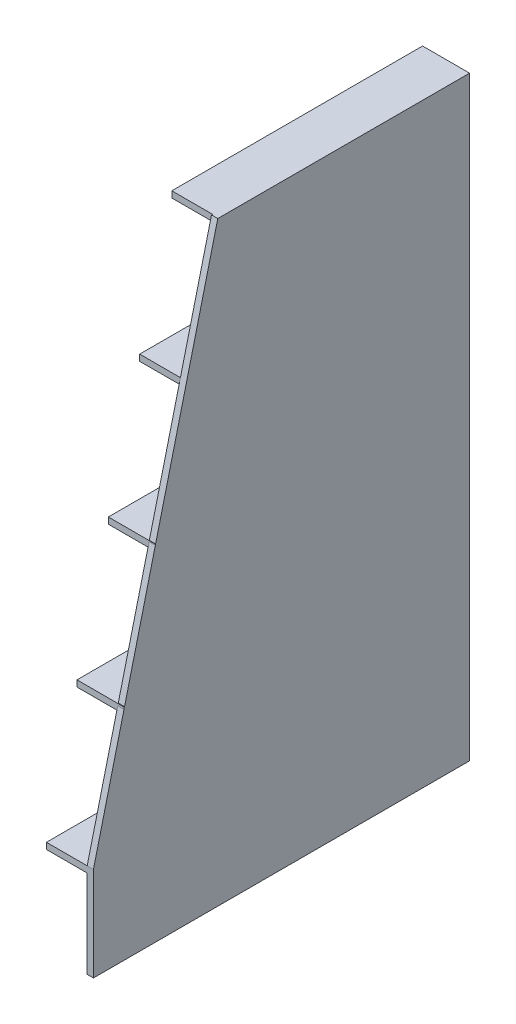
ISO-10303-21;
HEADER;
FILE_DESCRIPTION(('STEP AP214'),'2;1');
FILE_NAME('part.step','',(''),(''),'','','');
FILE_SCHEMA(('AUTOMOTIVE_DESIGN { 1 0 10303 214 1 1 1 1 }'));
ENDSEC;
DATA;
#1=APPLICATION_CONTEXT('core data for automotive mechanical design processes');
#2=APPLICATION_PROTOCOL_DEFINITION('international standard','automotive_design',2000,#1);
#3=PRODUCT_CONTEXT('',#1,'mechanical');
#4=PRODUCT('Part','Part','',(#3));
#5=PRODUCT_RELATED_PRODUCT_CATEGORY('part','',(#4));
#6=PRODUCT_DEFINITION_FORMATION('','',#4);
#7=PRODUCT_DEFINITION_CONTEXT('part definition',#1,'design');
#8=PRODUCT_DEFINITION('design','',#6,#7);
#9=PRODUCT_DEFINITION_SHAPE('','',#8);
#10=(LENGTH_UNIT() NAMED_UNIT(*) SI_UNIT(.MILLI.,.METRE.));
#11=(NAMED_UNIT(*) PLANE_ANGLE_UNIT() SI_UNIT($,.RADIAN.));
#12=(NAMED_UNIT(*) SI_UNIT($,.STERADIAN.) SOLID_ANGLE_UNIT());
#13=UNCERTAINTY_MEASURE_WITH_UNIT(LENGTH_MEASURE(1.E-05),#10,'distance_accuracy_value','');
#14=(GEOMETRIC_REPRESENTATION_CONTEXT(3) GLOBAL_UNCERTAINTY_ASSIGNED_CONTEXT((#13)) GLOBAL_UNIT_ASSIGNED_CONTEXT((#10,
#11,#12)) REPRESENTATION_CONTEXT('',''));
#15=CARTESIAN_POINT('',(0.,0.,0.));
#16=DIRECTION('',(0.,0.,1.));
#17=DIRECTION('',(1.,0.,0.));
#18=AXIS2_PLACEMENT_3D('',#15,#16,#17);
#19=CARTESIAN_POINT('',(150.,680.,1.36952681495711E-13));
#20=DIRECTION('',(0.,-1.,0.));
#21=DIRECTION('',(0.,0.,-1.));
#22=AXIS2_PLACEMENT_3D('',#19,#20,#21);
#23=PLANE('',#22);
#24=DIRECTION('',(-1.,0.,0.));
#25=VECTOR('',#24,1.);
#26=CARTESIAN_POINT('',(150.,680.,20.));
#27=LINE('',#26,#25);
#28=CARTESIAN_POINT('',(130.,680.,20.));
#29=VERTEX_POINT('',#28);
#30=CARTESIAN_POINT('',(0.,680.,20.));
#31=VERTEX_POINT('',#30);
#32=EDGE_CURVE('E432',#29,#31,#27,.T.);
#33=ORIENTED_EDGE('',*,*,#32,.F.);
#34=DIRECTION('',(0.,0.,1.));
#35=VECTOR('',#34,1.);
#36=CARTESIAN_POINT('',(130.,680.,1.36952681495711E-13));
#37=LINE('',#36,#35);
#38=CARTESIAN_POINT('',(130.,680.,1102.5));
#39=VERTEX_POINT('',#38);
#40=EDGE_CURVE('E304',#29,#39,#37,.T.);
#41=ORIENTED_EDGE('',*,*,#40,.T.);
#42=DIRECTION('',(-1.,0.,0.));
#43=VECTOR('',#42,1.);
#44=CARTESIAN_POINT('',(150.,680.,1102.5));
#45=LINE('',#44,#43);
#46=CARTESIAN_POINT('',(0.,680.,1102.5));
#47=VERTEX_POINT('',#46);
#48=EDGE_CURVE('E434',#39,#47,#45,.T.);
#49=ORIENTED_EDGE('',*,*,#48,.T.);
#50=DIRECTION('',(0.,0.,1.));
#51=VECTOR('',#50,1.);
#52=CARTESIAN_POINT('',(0.,680.,1.36952681495711E-13));
#53=LINE('',#52,#51);
#54=EDGE_CURVE('E336',#31,#47,#53,.T.);
#55=ORIENTED_EDGE('',*,*,#54,.F.);
#56=EDGE_LOOP('',(#33,#41,#49,#55));
#57=FACE_BOUND('',#56,.T.);
#58=ADVANCED_FACE('F35',(#57),#23,.T.);
#59=CARTESIAN_POINT('',(150.,0.,20.));
#60=DIRECTION('',(0.,0.,1.));
#61=DIRECTION('',(1.,0.,0.));
#62=AXIS2_PLACEMENT_3D('',#59,#60,#61);
#63=PLANE('',#62);
#64=DIRECTION('',(-1.,0.,0.));
#65=VECTOR('',#64,1.);
#66=CARTESIAN_POINT('',(150.,300.,20.));
#67=LINE('',#66,#65);
#68=CARTESIAN_POINT('',(130.,300.,20.));
#69=VERTEX_POINT('',#68);
#70=CARTESIAN_POINT('',(0.,300.,20.));
#71=VERTEX_POINT('',#70);
#72=EDGE_CURVE('E430',#69,#71,#67,.T.);
#73=ORIENTED_EDGE('',*,*,#72,.F.);
#74=DIRECTION('',(0.,1.,0.));
#75=VECTOR('',#74,1.);
#76=CARTESIAN_POINT('',(130.,0.,20.));
#77=LINE('',#76,#75);
#78=EDGE_CURVE('E301',#69,#29,#77,.T.);
#79=ORIENTED_EDGE('',*,*,#78,.T.);
#80=ORIENTED_EDGE('',*,*,#32,.T.);
#81=DIRECTION('',(0.,1.,0.));
#82=VECTOR('',#81,1.);
#83=CARTESIAN_POINT('',(0.,0.,20.));
#84=LINE('',#83,#82);
#85=EDGE_CURVE('E339',#71,#31,#84,.T.);
#86=ORIENTED_EDGE('',*,*,#85,.F.);
#87=EDGE_LOOP('',(#73,#79,#80,#86));
#88=FACE_BOUND('',#87,.T.);
#89=ADVANCED_FACE('F525',(#88),#63,.T.);
#90=CARTESIAN_POINT('',(150.,300.,0.));
#91=DIRECTION('',(0.,-1.,0.));
#92=DIRECTION('',(0.,0.,-1.));
#93=AXIS2_PLACEMENT_3D('',#90,#91,#92);
#94=PLANE('',#93);
#95=DIRECTION('',(0.,0.,1.));
#96=VECTOR('',#95,1.);
#97=CARTESIAN_POINT('',(130.,300.,0.));
#98=LINE('',#97,#96);
#99=CARTESIAN_POINT('',(130.,300.,1200.));
#100=VERTEX_POINT('',#99);
#101=EDGE_CURVE('E299',#69,#100,#98,.T.);
#102=ORIENTED_EDGE('',*,*,#101,.F.);
#103=ORIENTED_EDGE('',*,*,#72,.T.);
#104=DIRECTION('',(0.,0.,1.));
#105=VECTOR('',#104,1.);
#106=CARTESIAN_POINT('',(0.,300.,0.));
#107=LINE('',#106,#105);
#108=CARTESIAN_POINT('',(0.,300.,1200.));
#109=VERTEX_POINT('',#108);
#110=EDGE_CURVE('E342',#71,#109,#107,.T.);
#111=ORIENTED_EDGE('',*,*,#110,.T.);
#112=DIRECTION('',(-1.,0.,0.));
#113=VECTOR('',#112,1.);
#114=CARTESIAN_POINT('',(150.,300.,1200.));
#115=LINE('',#114,#113);
#116=EDGE_CURVE('E426',#100,#109,#115,.T.);
#117=ORIENTED_EDGE('',*,*,#116,.F.);
#118=EDGE_LOOP('',(#102,#103,#111,#117));
#119=FACE_BOUND('',#118,.T.);
#120=ADVANCED_FACE('F522',(#119),#94,.F.);
#121=CARTESIAN_POINT('',(150.,280.,0.));
#122=DIRECTION('',(0.,-1.,0.));
#123=DIRECTION('',(0.,0.,-1.));
#124=AXIS2_PLACEMENT_3D('',#121,#122,#123);
#125=PLANE('',#124);
#126=DIRECTION('',(-1.,0.,0.));
#127=VECTOR('',#126,1.);
#128=CARTESIAN_POINT('',(150.,280.,20.));
#129=LINE('',#128,#127);
#130=CARTESIAN_POINT('',(130.,280.,20.));
#131=VERTEX_POINT('',#130);
#132=CARTESIAN_POINT('',(0.,280.,20.));
#133=VERTEX_POINT('',#132);
#134=EDGE_CURVE('E422',#131,#133,#129,.T.);
#135=ORIENTED_EDGE('',*,*,#134,.F.);
#136=DIRECTION('',(0.,0.,1.));
#137=VECTOR('',#136,1.);
#138=CARTESIAN_POINT('',(130.,280.,0.));
#139=LINE('',#138,#137);
#140=CARTESIAN_POINT('',(130.,280.,1200.));
#141=VERTEX_POINT('',#140);
#142=EDGE_CURVE('E297',#131,#141,#139,.T.);
#143=ORIENTED_EDGE('',*,*,#142,.T.);
#144=DIRECTION('',(-1.,0.,0.));
#145=VECTOR('',#144,1.);
#146=CARTESIAN_POINT('',(150.,280.,1200.));
#147=LINE('',#146,#145);
#148=CARTESIAN_POINT('',(0.,280.,1200.));
#149=VERTEX_POINT('',#148);
#150=EDGE_CURVE('E424',#141,#149,#147,.T.);
#151=ORIENTED_EDGE('',*,*,#150,.T.);
#152=DIRECTION('',(0.,0.,1.));
#153=VECTOR('',#152,1.);
#154=CARTESIAN_POINT('',(0.,280.,0.));
#155=LINE('',#154,#153);
#156=EDGE_CURVE('E348',#133,#149,#155,.T.);
#157=ORIENTED_EDGE('',*,*,#156,.F.);
#158=EDGE_LOOP('',(#135,#143,#151,#157));
#159=FACE_BOUND('',#158,.T.);
#160=ADVANCED_FACE('F510',(#159),#125,.T.);
#161=CARTESIAN_POINT('',(150.,0.,20.));
#162=DIRECTION('',(0.,0.,1.));
#163=DIRECTION('',(1.,0.,0.));
#164=AXIS2_PLACEMENT_3D('',#161,#162,#163);
#165=PLANE('',#164);
#166=DIRECTION('',(-1.,0.,0.));
#167=VECTOR('',#166,1.);
#168=CARTESIAN_POINT('',(150.,0.,20.));
#169=LINE('',#168,#167);
#170=CARTESIAN_POINT('',(130.,0.,20.));
#171=VERTEX_POINT('',#170);
#172=CARTESIAN_POINT('',(0.,0.,20.));
#173=VERTEX_POINT('',#172);
#174=EDGE_CURVE('E420',#171,#173,#169,.T.);
#175=ORIENTED_EDGE('',*,*,#174,.F.);
#176=DIRECTION('',(0.,1.,0.));
#177=VECTOR('',#176,1.);
#178=CARTESIAN_POINT('',(130.,0.,20.));
#179=LINE('',#178,#177);
#180=EDGE_CURVE('E295',#171,#131,#179,.T.);
#181=ORIENTED_EDGE('',*,*,#180,.T.);
#182=ORIENTED_EDGE('',*,*,#134,.T.);
#183=DIRECTION('',(0.,1.,0.));
#184=VECTOR('',#183,1.);
#185=CARTESIAN_POINT('',(0.,0.,20.));
#186=LINE('',#185,#184);
#187=EDGE_CURVE('E351',#173,#133,#186,.T.);
#188=ORIENTED_EDGE('',*,*,#187,.F.);
#189=EDGE_LOOP('',(#175,#181,#182,#188));
#190=FACE_BOUND('',#189,.T.);
#191=ADVANCED_FACE('F504',(#190),#165,.T.);
#192=CARTESIAN_POINT('',(150.,0.,800.));
#193=DIRECTION('',(0.,0.,-1.));
#194=DIRECTION('',(-1.,0.,0.));
#195=AXIS2_PLACEMENT_3D('',#192,#193,#194);
#196=PLANE('',#195);
#197=DIRECTION('',(0.,-1.,0.));
#198=VECTOR('',#197,1.);
#199=CARTESIAN_POINT('',(130.,0.,800.));
#200=LINE('',#199,#198);
#201=CARTESIAN_POINT('',(130.,1900.,800.));
#202=VERTEX_POINT('',#201);
#203=CARTESIAN_POINT('',(130.,1880.,800.));
#204=VERTEX_POINT('',#203);
#205=EDGE_CURVE('E293',#202,#204,#200,.T.);
#206=ORIENTED_EDGE('',*,*,#205,.F.);
#207=DIRECTION('',(-1.,0.,0.));
#208=VECTOR('',#207,1.);
#209=CARTESIAN_POINT('',(150.,1900.,800.));
#210=LINE('',#209,#208);
#211=CARTESIAN_POINT('',(0.,1900.,800.));
#212=VERTEX_POINT('',#211);
#213=EDGE_CURVE('E230',#202,#212,#210,.T.);
#214=ORIENTED_EDGE('',*,*,#213,.T.);
#215=DIRECTION('',(0.,-1.,0.));
#216=VECTOR('',#215,1.);
#217=CARTESIAN_POINT('',(0.,0.,800.));
#218=LINE('',#217,#216);
#219=CARTESIAN_POINT('',(0.,1880.,800.));
#220=VERTEX_POINT('',#219);
#221=EDGE_CURVE('E362',#212,#220,#218,.T.);
#222=ORIENTED_EDGE('',*,*,#221,.T.);
#223=DIRECTION('',(-1.,0.,0.));
#224=VECTOR('',#223,1.);
#225=CARTESIAN_POINT('',(150.,1880.,800.));
#226=LINE('',#225,#224);
#227=EDGE_CURVE('E413',#204,#220,#226,.T.);
#228=ORIENTED_EDGE('',*,*,#227,.F.);
#229=EDGE_LOOP('',(#206,#214,#222,#228));
#230=FACE_BOUND('',#229,.T.);
#231=ADVANCED_FACE('F494',(#230),#196,.F.);
#232=CARTESIAN_POINT('',(150.,1880.,0.));
#233=DIRECTION('',(0.,-1.,0.));
#234=DIRECTION('',(0.,0.,-1.));
#235=AXIS2_PLACEMENT_3D('',#232,#233,#234);
#236=PLANE('',#235);
#237=DIRECTION('',(-1.,0.,0.));
#238=VECTOR('',#237,1.);
#239=CARTESIAN_POINT('',(150.,1880.,20.));
#240=LINE('',#239,#238);
#241=CARTESIAN_POINT('',(130.,1880.,20.));
#242=VERTEX_POINT('',#241);
#243=CARTESIAN_POINT('',(0.,1880.,20.));
#244=VERTEX_POINT('',#243);
#245=EDGE_CURVE('E411',#242,#244,#240,.T.);
#246=ORIENTED_EDGE('',*,*,#245,.F.);
#247=DIRECTION('',(0.,0.,1.));
#248=VECTOR('',#247,1.);
#249=CARTESIAN_POINT('',(130.,1880.,0.));
#250=LINE('',#249,#248);
#251=EDGE_CURVE('E290',#242,#204,#250,.T.);
#252=ORIENTED_EDGE('',*,*,#251,.T.);
#253=ORIENTED_EDGE('',*,*,#227,.T.);
#254=DIRECTION('',(0.,0.,1.));
#255=VECTOR('',#254,1.);
#256=CARTESIAN_POINT('',(0.,1880.,0.));
#257=LINE('',#256,#255);
#258=EDGE_CURVE('E365',#244,#220,#257,.T.);
#259=ORIENTED_EDGE('',*,*,#258,.F.);
#260=EDGE_LOOP('',(#246,#252,#253,#259));
#261=FACE_BOUND('',#260,.T.);
#262=ADVANCED_FACE('F488',(#261),#236,.T.);
#263=CARTESIAN_POINT('',(150.,0.,20.));
#264=DIRECTION('',(0.,0.,1.));
#265=DIRECTION('',(1.,0.,0.));
#266=AXIS2_PLACEMENT_3D('',#263,#264,#265);
#267=PLANE('',#266);
#268=DIRECTION('',(-1.,0.,0.));
#269=VECTOR('',#268,1.);
#270=CARTESIAN_POINT('',(150.,1500.,20.));
#271=LINE('',#270,#269);
#272=CARTESIAN_POINT('',(130.,1500.,20.));
#273=VERTEX_POINT('',#272);
#274=CARTESIAN_POINT('',(0.,1500.,20.));
#275=VERTEX_POINT('',#274);
#276=EDGE_CURVE('E409',#273,#275,#271,.T.);
#277=ORIENTED_EDGE('',*,*,#276,.F.);
#278=DIRECTION('',(0.,1.,0.));
#279=VECTOR('',#278,1.);
#280=CARTESIAN_POINT('',(130.,0.,20.));
#281=LINE('',#280,#279);
#282=EDGE_CURVE('E287',#273,#242,#281,.T.);
#283=ORIENTED_EDGE('',*,*,#282,.T.);
#284=ORIENTED_EDGE('',*,*,#245,.T.);
#285=DIRECTION('',(0.,1.,0.));
#286=VECTOR('',#285,1.);
#287=CARTESIAN_POINT('',(0.,0.,20.));
#288=LINE('',#287,#286);
#289=EDGE_CURVE('E368',#275,#244,#288,.T.);
#290=ORIENTED_EDGE('',*,*,#289,.F.);
#291=EDGE_LOOP('',(#277,#283,#284,#290));
#292=FACE_BOUND('',#291,.T.);
#293=ADVANCED_FACE('F484',(#292),#267,.T.);
#294=CARTESIAN_POINT('',(150.,1500.,0.));
#295=DIRECTION('',(0.,-1.,0.));
#296=DIRECTION('',(0.,0.,-1.));
#297=AXIS2_PLACEMENT_3D('',#294,#295,#296);
#298=PLANE('',#297);
#299=DIRECTION('',(0.,0.,1.));
#300=VECTOR('',#299,1.);
#301=CARTESIAN_POINT('',(130.,1500.,0.));
#302=LINE('',#301,#300);
#303=CARTESIAN_POINT('',(130.,1500.,902.5));
#304=VERTEX_POINT('',#303);
#305=EDGE_CURVE('E249',#273,#304,#302,.T.);
#306=ORIENTED_EDGE('',*,*,#305,.F.);
#307=ORIENTED_EDGE('',*,*,#276,.T.);
#308=DIRECTION('',(0.,0.,1.));
#309=VECTOR('',#308,1.);
#310=CARTESIAN_POINT('',(0.,1500.,0.));
#311=LINE('',#310,#309);
#312=CARTESIAN_POINT('',(0.,1500.,902.5));
#313=VERTEX_POINT('',#312);
#314=EDGE_CURVE('E371',#275,#313,#311,.T.);
#315=ORIENTED_EDGE('',*,*,#314,.T.);
#316=DIRECTION('',(-1.,0.,0.));
#317=VECTOR('',#316,1.);
#318=CARTESIAN_POINT('',(150.,1500.,902.5));
#319=LINE('',#318,#317);
#320=EDGE_CURVE('E407',#304,#313,#319,.T.);
#321=ORIENTED_EDGE('',*,*,#320,.F.);
#322=EDGE_LOOP('',(#306,#307,#315,#321));
#323=FACE_BOUND('',#322,.T.);
#324=ADVANCED_FACE('F480',(#323),#298,.F.);
#325=CARTESIAN_POINT('',(150.,0.,902.5));
#326=DIRECTION('',(0.,0.,-1.));
#327=DIRECTION('',(-1.,0.,0.));
#328=AXIS2_PLACEMENT_3D('',#325,#326,#327);
#329=PLANE('',#328);
#330=DIRECTION('',(0.,-1.,0.));
#331=VECTOR('',#330,1.);
#332=CARTESIAN_POINT('',(130.,0.,902.5));
#333=LINE('',#332,#331);
#334=CARTESIAN_POINT('',(130.,1480.,902.5));
#335=VERTEX_POINT('',#334);
#336=EDGE_CURVE('E284',#304,#335,#333,.T.);
#337=ORIENTED_EDGE('',*,*,#336,.F.);
#338=ORIENTED_EDGE('',*,*,#320,.T.);
#339=DIRECTION('',(0.,-1.,0.));
#340=VECTOR('',#339,1.);
#341=CARTESIAN_POINT('',(0.,0.,902.5));
#342=LINE('',#341,#340);
#343=CARTESIAN_POINT('',(0.,1480.,902.5));
#344=VERTEX_POINT('',#343);
#345=EDGE_CURVE('E374',#313,#344,#342,.T.);
#346=ORIENTED_EDGE('',*,*,#345,.T.);
#347=DIRECTION('',(-1.,0.,0.));
#348=VECTOR('',#347,1.);
#349=CARTESIAN_POINT('',(150.,1480.,902.5));
#350=LINE('',#349,#348);
#351=EDGE_CURVE('E405',#335,#344,#350,.T.);
#352=ORIENTED_EDGE('',*,*,#351,.F.);
#353=EDGE_LOOP('',(#337,#338,#346,#352));
#354=FACE_BOUND('',#353,.T.);
#355=ADVANCED_FACE('F477',(#354),#329,.F.);
#356=CARTESIAN_POINT('',(150.,1480.,3.64128548796727E-13));
#357=DIRECTION('',(0.,-1.,0.));
#358=DIRECTION('',(0.,0.,-1.));
#359=AXIS2_PLACEMENT_3D('',#356,#357,#358);
#360=PLANE('',#359);
#361=DIRECTION('',(-1.,0.,0.));
#362=VECTOR('',#361,1.);
#363=CARTESIAN_POINT('',(150.,1480.,20.));
#364=LINE('',#363,#362);
#365=CARTESIAN_POINT('',(130.,1480.,20.));
#366=VERTEX_POINT('',#365);
#367=CARTESIAN_POINT('',(0.,1480.,20.));
#368=VERTEX_POINT('',#367);
#369=EDGE_CURVE('E403',#366,#368,#364,.T.);
#370=ORIENTED_EDGE('',*,*,#369,.F.);
#371=DIRECTION('',(0.,0.,1.));
#372=VECTOR('',#371,1.);
#373=CARTESIAN_POINT('',(130.,1480.,3.64128548796727E-13));
#374=LINE('',#373,#372);
#375=EDGE_CURVE('E281',#366,#335,#374,.T.);
#376=ORIENTED_EDGE('',*,*,#375,.T.);
#377=ORIENTED_EDGE('',*,*,#351,.T.);
#378=DIRECTION('',(0.,0.,1.));
#379=VECTOR('',#378,1.);
#380=CARTESIAN_POINT('',(0.,1480.,3.64128548796727E-13));
#381=LINE('',#380,#379);
#382=EDGE_CURVE('E377',#368,#344,#381,.T.);
#383=ORIENTED_EDGE('',*,*,#382,.F.);
#384=EDGE_LOOP('',(#370,#376,#377,#383));
#385=FACE_BOUND('',#384,.T.);
#386=ADVANCED_FACE('F474',(#385),#360,.T.);
#387=CARTESIAN_POINT('',(150.,0.,20.));
#388=DIRECTION('',(0.,0.,1.));
#389=DIRECTION('',(1.,0.,0.));
#390=AXIS2_PLACEMENT_3D('',#387,#388,#389);
#391=PLANE('',#390);
#392=DIRECTION('',(-1.,0.,0.));
#393=VECTOR('',#392,1.);
#394=CARTESIAN_POINT('',(150.,1100.,20.));
#395=LINE('',#394,#393);
#396=CARTESIAN_POINT('',(130.,1100.,20.));
#397=VERTEX_POINT('',#396);
#398=CARTESIAN_POINT('',(0.,1100.,20.));
#399=VERTEX_POINT('',#398);
#400=EDGE_CURVE('E401',#397,#399,#395,.T.);
#401=ORIENTED_EDGE('',*,*,#400,.F.);
#402=DIRECTION('',(0.,1.,0.));
#403=VECTOR('',#402,1.);
#404=CARTESIAN_POINT('',(130.,0.,20.));
#405=LINE('',#404,#403);
#406=EDGE_CURVE('E273',#397,#366,#405,.T.);
#407=ORIENTED_EDGE('',*,*,#406,.T.);
#408=ORIENTED_EDGE('',*,*,#369,.T.);
#409=DIRECTION('',(0.,1.,0.));
#410=VECTOR('',#409,1.);
#411=CARTESIAN_POINT('',(0.,0.,20.));
#412=LINE('',#411,#410);
#413=EDGE_CURVE('E380',#399,#368,#412,.T.);
#414=ORIENTED_EDGE('',*,*,#413,.F.);
#415=EDGE_LOOP('',(#401,#407,#408,#414));
#416=FACE_BOUND('',#415,.T.);
#417=ADVANCED_FACE('F468',(#416),#391,.T.);
#418=CARTESIAN_POINT('',(150.,1080.,2.39210147949161E-13));
#419=DIRECTION('',(0.,-1.,0.));
#420=DIRECTION('',(0.,0.,-1.));
#421=AXIS2_PLACEMENT_3D('',#418,#419,#420);
#422=PLANE('',#421);
#423=DIRECTION('',(-1.,0.,0.));
#424=VECTOR('',#423,1.);
#425=CARTESIAN_POINT('',(150.,1080.,20.));
#426=LINE('',#425,#424);
#427=CARTESIAN_POINT('',(130.,1080.,20.));
#428=VERTEX_POINT('',#427);
#429=CARTESIAN_POINT('',(0.,1080.,20.));
#430=VERTEX_POINT('',#429);
#431=EDGE_CURVE('E394',#428,#430,#426,.T.);
#432=ORIENTED_EDGE('',*,*,#431,.F.);
#433=DIRECTION('',(0.,0.,1.));
#434=VECTOR('',#433,1.);
#435=CARTESIAN_POINT('',(130.,1080.,2.39210147949161E-13));
#436=LINE('',#435,#434);
#437=CARTESIAN_POINT('',(130.,1080.,1002.5));
#438=VERTEX_POINT('',#437);
#439=EDGE_CURVE('E275',#428,#438,#436,.T.);
#440=ORIENTED_EDGE('',*,*,#439,.T.);
#441=DIRECTION('',(-1.,0.,0.));
#442=VECTOR('',#441,1.);
#443=CARTESIAN_POINT('',(150.,1080.,1002.5));
#444=LINE('',#443,#442);
#445=CARTESIAN_POINT('',(0.,1080.,1002.5));
#446=VERTEX_POINT('',#445);
#447=EDGE_CURVE('E396',#438,#446,#444,.T.);
#448=ORIENTED_EDGE('',*,*,#447,.T.);
#449=DIRECTION('',(0.,0.,1.));
#450=VECTOR('',#449,1.);
#451=CARTESIAN_POINT('',(0.,1080.,2.39210147949161E-13));
#452=LINE('',#451,#450);
#453=EDGE_CURVE('E388',#430,#446,#452,.T.);
#454=ORIENTED_EDGE('',*,*,#453,.F.);
#455=EDGE_LOOP('',(#432,#440,#448,#454));
#456=FACE_BOUND('',#455,.T.);
#457=ADVANCED_FACE('F452',(#456),#422,.T.);
#458=CARTESIAN_POINT('',(150.,0.,20.));
#459=DIRECTION('',(0.,0.,1.));
#460=DIRECTION('',(1.,0.,0.));
#461=AXIS2_PLACEMENT_3D('',#458,#459,#460);
#462=PLANE('',#461);
#463=DIRECTION('',(-1.,0.,0.));
#464=VECTOR('',#463,1.);
#465=CARTESIAN_POINT('',(150.,700.,20.));
#466=LINE('',#465,#464);
#467=CARTESIAN_POINT('',(130.,700.,20.));
#468=VERTEX_POINT('',#467);
#469=CARTESIAN_POINT('',(0.,700.,20.));
#470=VERTEX_POINT('',#469);
#471=EDGE_CURVE('E330',#468,#470,#466,.T.);
#472=ORIENTED_EDGE('',*,*,#471,.F.);
#473=DIRECTION('',(0.,1.,0.));
#474=VECTOR('',#473,1.);
#475=CARTESIAN_POINT('',(130.,0.,20.));
#476=LINE('',#475,#474);
#477=EDGE_CURVE('E11',#468,#428,#476,.T.);
#478=ORIENTED_EDGE('',*,*,#477,.T.);
#479=ORIENTED_EDGE('',*,*,#431,.T.);
#480=DIRECTION('',(0.,1.,0.));
#481=VECTOR('',#480,1.);
#482=CARTESIAN_POINT('',(0.,0.,20.));
#483=LINE('',#482,#481);
#484=EDGE_CURVE('E313',#470,#430,#483,.T.);
#485=ORIENTED_EDGE('',*,*,#484,.F.);
#486=EDGE_LOOP('',(#472,#478,#479,#485));
#487=FACE_BOUND('',#486,.T.);
#488=ADVANCED_FACE('F448',(#487),#462,.T.);
#489=CARTESIAN_POINT('',(150.,700.,0.));
#490=DIRECTION('',(0.,-1.,0.));
#491=DIRECTION('',(0.,0.,-1.));
#492=AXIS2_PLACEMENT_3D('',#489,#490,#491);
#493=PLANE('',#492);
#494=DIRECTION('',(0.,0.,1.));
#495=VECTOR('',#494,1.);
#496=CARTESIAN_POINT('',(150.,700.,0.));
#497=LINE('',#496,#495);
#498=CARTESIAN_POINT('',(150.,700.,1100.83333333333));
#499=VERTEX_POINT('',#498);
#500=CARTESIAN_POINT('',(150.,700.,1102.5));
#501=VERTEX_POINT('',#500);
#502=EDGE_CURVE('E310',#499,#501,#497,.T.);
#503=ORIENTED_EDGE('',*,*,#502,.F.);
#504=DIRECTION('',(-1.,0.,0.));
#505=VECTOR('',#504,1.);
#506=CARTESIAN_POINT('',(150.,700.,1100.83333333333));
#507=LINE('',#506,#505);
#508=CARTESIAN_POINT('',(130.,700.,1100.83333333333));
#509=VERTEX_POINT('',#508);
#510=EDGE_CURVE('E50',#499,#509,#507,.T.);
#511=ORIENTED_EDGE('',*,*,#510,.T.);
#512=DIRECTION('',(0.,0.,1.));
#513=VECTOR('',#512,1.);
#514=CARTESIAN_POINT('',(130.,700.,0.));
#515=LINE('',#514,#513);
#516=EDGE_CURVE('E269',#468,#509,#515,.T.);
#517=ORIENTED_EDGE('',*,*,#516,.F.);
#518=ORIENTED_EDGE('',*,*,#471,.T.);
#519=DIRECTION('',(0.,0.,1.));
#520=VECTOR('',#519,1.);
#521=CARTESIAN_POINT('',(0.,700.,0.));
#522=LINE('',#521,#520);
#523=CARTESIAN_POINT('',(0.,700.,1102.5));
#524=VERTEX_POINT('',#523);
#525=EDGE_CURVE('E309',#470,#524,#522,.T.);
#526=ORIENTED_EDGE('',*,*,#525,.T.);
#527=DIRECTION('',(-1.,0.,0.));
#528=VECTOR('',#527,1.);
#529=CARTESIAN_POINT('',(150.,700.,1102.5));
#530=LINE('',#529,#528);
#531=EDGE_CURVE('E43',#501,#524,#530,.T.);
#532=ORIENTED_EDGE('',*,*,#531,.F.);
#533=EDGE_LOOP('',(#503,#511,#517,#518,#526,#532));
#534=FACE_BOUND('',#533,.T.);
#535=ADVANCED_FACE('F37',(#534),#493,.F.);
#536=CARTESIAN_POINT('',(150.,0.,1102.5));
#537=DIRECTION('',(0.,0.,-1.));
#538=DIRECTION('',(-1.,0.,0.));
#539=AXIS2_PLACEMENT_3D('',#536,#537,#538);
#540=PLANE('',#539);
#541=DIRECTION('',(0.,-1.,0.));
#542=VECTOR('',#541,1.);
#543=CARTESIAN_POINT('',(130.,0.,1102.5));
#544=LINE('',#543,#542);
#545=CARTESIAN_POINT('',(130.,693.277310924369,1102.5));
#546=VERTEX_POINT('',#545);
#547=EDGE_CURVE('E307',#546,#39,#544,.T.);
#548=ORIENTED_EDGE('',*,*,#547,.F.);
#549=DIRECTION('',(1.,0.,0.));
#550=VECTOR('',#549,1.);
#551=CARTESIAN_POINT('',(150.,693.277310924369,1102.5));
#552=LINE('',#551,#550);
#553=CARTESIAN_POINT('',(150.,693.277310924369,1102.5));
#554=VERTEX_POINT('',#553);
#555=EDGE_CURVE('E529',#546,#554,#552,.T.);
#556=ORIENTED_EDGE('',*,*,#555,.T.);
#557=DIRECTION('',(0.,-1.,0.));
#558=VECTOR('',#557,1.);
#559=CARTESIAN_POINT('',(150.,0.,1102.5));
#560=LINE('',#559,#558);
#561=EDGE_CURVE('E312',#501,#554,#560,.T.);
#562=ORIENTED_EDGE('',*,*,#561,.F.);
#563=ORIENTED_EDGE('',*,*,#531,.T.);
#564=DIRECTION('',(0.,-1.,0.));
#565=VECTOR('',#564,1.);
#566=CARTESIAN_POINT('',(0.,0.,1102.5));
#567=LINE('',#566,#565);
#568=EDGE_CURVE('E333',#524,#47,#567,.T.);
#569=ORIENTED_EDGE('',*,*,#568,.T.);
#570=ORIENTED_EDGE('',*,*,#48,.F.);
#571=EDGE_LOOP('',(#548,#556,#562,#563,#569,#570));
#572=FACE_BOUND('',#571,.T.);
#573=ADVANCED_FACE('F440',(#572),#540,.F.);
#574=CARTESIAN_POINT('',(150.,0.,1200.));
#575=DIRECTION('',(0.,0.,-1.));
#576=DIRECTION('',(-1.,0.,0.));
#577=AXIS2_PLACEMENT_3D('',#574,#575,#576);
#578=PLANE('',#577);
#579=CARTESIAN_POINT('',(150.,300.,1200.));
#580=VERTEX_POINT('',#579);
#581=EDGE_CURVE('E427',#580,#100,#115,.T.);
#582=ORIENTED_EDGE('',*,*,#581,.T.);
#583=ORIENTED_EDGE('',*,*,#116,.T.);
#584=DIRECTION('',(0.,-1.,0.));
#585=VECTOR('',#584,1.);
#586=CARTESIAN_POINT('',(0.,0.,1200.));
#587=LINE('',#586,#585);
#588=EDGE_CURVE('E345',#109,#149,#587,.T.);
#589=ORIENTED_EDGE('',*,*,#588,.T.);
#590=ORIENTED_EDGE('',*,*,#150,.F.);
#591=DIRECTION('',(0.,-1.,0.));
#592=VECTOR('',#591,1.);
#593=CARTESIAN_POINT('',(130.,0.,1200.));
#594=LINE('',#593,#592);
#595=CARTESIAN_POINT('',(130.,0.,1200.));
#596=VERTEX_POINT('',#595);
#597=EDGE_CURVE('E245',#141,#596,#594,.T.);
#598=ORIENTED_EDGE('',*,*,#597,.T.);
#599=DIRECTION('',(1.,0.,0.));
#600=VECTOR('',#599,1.);
#601=CARTESIAN_POINT('',(130.,0.,1200.));
#602=LINE('',#601,#600);
#603=CARTESIAN_POINT('',(150.,0.,1200.));
#604=VERTEX_POINT('',#603);
#605=EDGE_CURVE('E244',#596,#604,#602,.T.);
#606=ORIENTED_EDGE('',*,*,#605,.T.);
#607=DIRECTION('',(0.,-1.,0.));
#608=VECTOR('',#607,1.);
#609=CARTESIAN_POINT('',(150.,0.,1200.));
#610=LINE('',#609,#608);
#611=EDGE_CURVE('E316',#580,#604,#610,.T.);
#612=ORIENTED_EDGE('',*,*,#611,.F.);
#613=EDGE_LOOP('',(#582,#583,#589,#590,#598,#606,#612));
#614=FACE_BOUND('',#613,.T.);
#615=ADVANCED_FACE('F516',(#614),#578,.F.);
#616=CARTESIAN_POINT('',(150.,0.,0.));
#617=DIRECTION('',(0.,1.,0.));
#618=DIRECTION('',(0.,0.,1.));
#619=AXIS2_PLACEMENT_3D('',#616,#617,#618);
#620=PLANE('',#619);
#621=DIRECTION('',(0.,0.,-1.));
#622=VECTOR('',#621,1.);
#623=CARTESIAN_POINT('',(150.,0.,0.));
#624=LINE('',#623,#622);
#625=CARTESIAN_POINT('',(150.,0.,0.));
#626=VERTEX_POINT('',#625);
#627=EDGE_CURVE('E319',#604,#626,#624,.T.);
#628=ORIENTED_EDGE('',*,*,#627,.F.);
#629=ORIENTED_EDGE('',*,*,#605,.F.);
#630=DIRECTION('',(0.,0.,-1.));
#631=VECTOR('',#630,1.);
#632=CARTESIAN_POINT('',(130.,0.,0.));
#633=LINE('',#632,#631);
#634=EDGE_CURVE('E234',#596,#171,#633,.T.);
#635=ORIENTED_EDGE('',*,*,#634,.T.);
#636=ORIENTED_EDGE('',*,*,#174,.T.);
#637=DIRECTION('',(0.,0.,-1.));
#638=VECTOR('',#637,1.);
#639=CARTESIAN_POINT('',(0.,0.,0.));
#640=LINE('',#639,#638);
#641=CARTESIAN_POINT('',(0.,0.,0.));
#642=VERTEX_POINT('',#641);
#643=EDGE_CURVE('E354',#173,#642,#640,.T.);
#644=ORIENTED_EDGE('',*,*,#643,.T.);
#645=DIRECTION('',(-1.,0.,0.));
#646=VECTOR('',#645,1.);
#647=CARTESIAN_POINT('',(150.,0.,0.));
#648=LINE('',#647,#646);
#649=EDGE_CURVE('E418',#626,#642,#648,.T.);
#650=ORIENTED_EDGE('',*,*,#649,.F.);
#651=EDGE_LOOP('',(#628,#629,#635,#636,#644,#650));
#652=FACE_BOUND('',#651,.T.);
#653=ADVANCED_FACE('F556',(#652),#620,.F.);
#654=CARTESIAN_POINT('',(150.,0.,0.));
#655=DIRECTION('',(0.,0.,1.));
#656=DIRECTION('',(1.,0.,0.));
#657=AXIS2_PLACEMENT_3D('',#654,#655,#656);
#658=PLANE('',#657);
#659=ORIENTED_EDGE('',*,*,#649,.T.);
#660=DIRECTION('',(0.,1.,0.));
#661=VECTOR('',#660,1.);
#662=CARTESIAN_POINT('',(0.,0.,0.));
#663=LINE('',#662,#661);
#664=CARTESIAN_POINT('',(0.,1900.,0.));
#665=VERTEX_POINT('',#664);
#666=EDGE_CURVE('E357',#642,#665,#663,.T.);
#667=ORIENTED_EDGE('',*,*,#666,.T.);
#668=DIRECTION('',(-1.,0.,0.));
#669=VECTOR('',#668,1.);
#670=CARTESIAN_POINT('',(150.,1900.,0.));
#671=LINE('',#670,#669);
#672=CARTESIAN_POINT('',(150.,1900.,0.));
#673=VERTEX_POINT('',#672);
#674=EDGE_CURVE('E416',#673,#665,#671,.T.);
#675=ORIENTED_EDGE('',*,*,#674,.F.);
#676=DIRECTION('',(0.,1.,0.));
#677=VECTOR('',#676,1.);
#678=CARTESIAN_POINT('',(150.,0.,0.));
#679=LINE('',#678,#677);
#680=EDGE_CURVE('E321',#626,#673,#679,.T.);
#681=ORIENTED_EDGE('',*,*,#680,.F.);
#682=EDGE_LOOP('',(#659,#667,#675,#681));
#683=FACE_BOUND('',#682,.T.);
#684=ADVANCED_FACE('F498',(#683),#658,.F.);
#685=CARTESIAN_POINT('',(150.,1900.,0.));
#686=DIRECTION('',(0.,-1.,0.));
#687=DIRECTION('',(0.,0.,-1.));
#688=AXIS2_PLACEMENT_3D('',#685,#686,#687);
#689=PLANE('',#688);
#690=ORIENTED_EDGE('',*,*,#674,.T.);
#691=DIRECTION('',(0.,0.,1.));
#692=VECTOR('',#691,1.);
#693=CARTESIAN_POINT('',(0.,1900.,0.));
#694=LINE('',#693,#692);
#695=EDGE_CURVE('E360',#665,#212,#694,.T.);
#696=ORIENTED_EDGE('',*,*,#695,.T.);
#697=ORIENTED_EDGE('',*,*,#213,.F.);
#698=DIRECTION('',(0.,0.,1.));
#699=VECTOR('',#698,1.);
#700=CARTESIAN_POINT('',(130.,1900.,0.));
#701=LINE('',#700,#699);
#702=CARTESIAN_POINT('',(130.,1900.,803.333333333333));
#703=VERTEX_POINT('',#702);
#704=EDGE_CURVE('E223',#202,#703,#701,.T.);
#705=ORIENTED_EDGE('',*,*,#704,.T.);
#706=DIRECTION('',(1.,0.,0.));
#707=VECTOR('',#706,1.);
#708=CARTESIAN_POINT('',(130.,1900.,803.333333333333));
#709=LINE('',#708,#707);
#710=CARTESIAN_POINT('',(150.,1900.,803.333333333333));
#711=VERTEX_POINT('',#710);
#712=EDGE_CURVE('E227',#703,#711,#709,.T.);
#713=ORIENTED_EDGE('',*,*,#712,.T.);
#714=DIRECTION('',(0.,0.,1.));
#715=VECTOR('',#714,1.);
#716=CARTESIAN_POINT('',(150.,1900.,0.));
#717=LINE('',#716,#715);
#718=EDGE_CURVE('E323',#673,#711,#717,.T.);
#719=ORIENTED_EDGE('',*,*,#718,.F.);
#720=EDGE_LOOP('',(#690,#696,#697,#705,#713,#719));
#721=FACE_BOUND('',#720,.T.);
#722=ADVANCED_FACE('F225',(#721),#689,.F.);
#723=CARTESIAN_POINT('',(150.,1100.,2.43639965503775E-13));
#724=DIRECTION('',(0.,-1.,0.));
#725=DIRECTION('',(0.,0.,-1.));
#726=AXIS2_PLACEMENT_3D('',#723,#724,#725);
#727=PLANE('',#726);
#728=DIRECTION('',(0.,0.,1.));
#729=VECTOR('',#728,1.);
#730=CARTESIAN_POINT('',(150.,1100.,2.43639965503775E-13));
#731=LINE('',#730,#729);
#732=CARTESIAN_POINT('',(150.,1100.,1001.66666666667));
#733=VERTEX_POINT('',#732);
#734=CARTESIAN_POINT('',(150.,1100.,1002.5));
#735=VERTEX_POINT('',#734);
#736=EDGE_CURVE('E325',#733,#735,#731,.T.);
#737=ORIENTED_EDGE('',*,*,#736,.F.);
#738=DIRECTION('',(-1.,0.,0.));
#739=VECTOR('',#738,1.);
#740=CARTESIAN_POINT('',(150.,1100.,1001.66666666667));
#741=LINE('',#740,#739);
#742=CARTESIAN_POINT('',(130.,1100.,1001.66666666667));
#743=VERTEX_POINT('',#742);
#744=EDGE_CURVE('E762',#733,#743,#741,.T.);
#745=ORIENTED_EDGE('',*,*,#744,.T.);
#746=DIRECTION('',(0.,0.,1.));
#747=VECTOR('',#746,1.);
#748=CARTESIAN_POINT('',(130.,1100.,2.43639965503775E-13));
#749=LINE('',#748,#747);
#750=EDGE_CURVE('E271',#397,#743,#749,.T.);
#751=ORIENTED_EDGE('',*,*,#750,.F.);
#752=ORIENTED_EDGE('',*,*,#400,.T.);
#753=DIRECTION('',(0.,0.,1.));
#754=VECTOR('',#753,1.);
#755=CARTESIAN_POINT('',(0.,1100.,2.43639965503775E-13));
#756=LINE('',#755,#754);
#757=CARTESIAN_POINT('',(0.,1100.,1002.5));
#758=VERTEX_POINT('',#757);
#759=EDGE_CURVE('E383',#399,#758,#756,.T.);
#760=ORIENTED_EDGE('',*,*,#759,.T.);
#761=DIRECTION('',(-1.,0.,0.));
#762=VECTOR('',#761,1.);
#763=CARTESIAN_POINT('',(150.,1100.,1002.5));
#764=LINE('',#763,#762);
#765=EDGE_CURVE('E398',#735,#758,#764,.T.);
#766=ORIENTED_EDGE('',*,*,#765,.F.);
#767=EDGE_LOOP('',(#737,#745,#751,#752,#760,#766));
#768=FACE_BOUND('',#767,.T.);
#769=ADVANCED_FACE('F463',(#768),#727,.F.);
#770=CARTESIAN_POINT('',(150.,0.,1002.5));
#771=DIRECTION('',(0.,0.,-1.));
#772=DIRECTION('',(-1.,0.,0.));
#773=AXIS2_PLACEMENT_3D('',#770,#771,#772);
#774=PLANE('',#773);
#775=DIRECTION('',(0.,-1.,0.));
#776=VECTOR('',#775,1.);
#777=CARTESIAN_POINT('',(130.,0.,1002.5));
#778=LINE('',#777,#776);
#779=CARTESIAN_POINT('',(130.,1096.63865546219,1002.5));
#780=VERTEX_POINT('',#779);
#781=EDGE_CURVE('E268',#780,#438,#778,.T.);
#782=ORIENTED_EDGE('',*,*,#781,.F.);
#783=DIRECTION('',(1.,0.,0.));
#784=VECTOR('',#783,1.);
#785=CARTESIAN_POINT('',(150.,1096.63865546219,1002.5));
#786=LINE('',#785,#784);
#787=CARTESIAN_POINT('',(150.,1096.63865546218,1002.5));
#788=VERTEX_POINT('',#787);
#789=EDGE_CURVE('E262',#780,#788,#786,.T.);
#790=ORIENTED_EDGE('',*,*,#789,.T.);
#791=DIRECTION('',(0.,-1.,0.));
#792=VECTOR('',#791,1.);
#793=CARTESIAN_POINT('',(150.,0.,1002.5));
#794=LINE('',#793,#792);
#795=EDGE_CURVE('E327',#735,#788,#794,.T.);
#796=ORIENTED_EDGE('',*,*,#795,.F.);
#797=ORIENTED_EDGE('',*,*,#765,.T.);
#798=DIRECTION('',(0.,-1.,0.));
#799=VECTOR('',#798,1.);
#800=CARTESIAN_POINT('',(0.,0.,1002.5));
#801=LINE('',#800,#799);
#802=EDGE_CURVE('E385',#758,#446,#801,.T.);
#803=ORIENTED_EDGE('',*,*,#802,.T.);
#804=ORIENTED_EDGE('',*,*,#447,.F.);
#805=EDGE_LOOP('',(#782,#790,#796,#797,#803,#804));
#806=FACE_BOUND('',#805,.T.);
#807=ADVANCED_FACE('F458',(#806),#774,.F.);
#808=CARTESIAN_POINT('',(150.,0.,0.));
#809=DIRECTION('',(1.,0.,0.));
#810=DIRECTION('',(0.,0.,-1.));
#811=AXIS2_PLACEMENT_3D('',#808,#809,#810);
#812=PLANE('',#811);
#813=DIRECTION('',(0.,-0.970616425745193,0.240631988882662));
#814=VECTOR('',#813,1.);
#815=CARTESIAN_POINT('',(150.,297.644759385184,1200.58390340242));
#816=LINE('',#815,#814);
#817=EDGE_CURVE('E770',#788,#499,#816,.T.);
#818=ORIENTED_EDGE('',*,*,#817,.T.);
#819=ORIENTED_EDGE('',*,*,#502,.T.);
#820=ORIENTED_EDGE('',*,*,#561,.T.);
#821=EDGE_CURVE('E771',#554,#580,#816,.T.);
#822=ORIENTED_EDGE('',*,*,#821,.T.);
#823=ORIENTED_EDGE('',*,*,#611,.T.);
#824=ORIENTED_EDGE('',*,*,#627,.T.);
#825=ORIENTED_EDGE('',*,*,#680,.T.);
#826=ORIENTED_EDGE('',*,*,#718,.T.);
#827=EDGE_CURVE('E243',#711,#733,#816,.T.);
#828=ORIENTED_EDGE('',*,*,#827,.T.);
#829=ORIENTED_EDGE('',*,*,#736,.T.);
#830=ORIENTED_EDGE('',*,*,#795,.T.);
#831=EDGE_LOOP('',(#818,#819,#820,#822,#823,#824,#825,#826,#828,#829,#830));
#832=FACE_BOUND('',#831,.T.);
#833=ADVANCED_FACE('F571',(#832),#812,.T.);
#834=CARTESIAN_POINT('',(0.,0.,0.));
#835=DIRECTION('',(1.,0.,0.));
#836=DIRECTION('',(0.,0.,-1.));
#837=AXIS2_PLACEMENT_3D('',#834,#835,#836);
#838=PLANE('',#837);
#839=ORIENTED_EDGE('',*,*,#525,.F.);
#840=ORIENTED_EDGE('',*,*,#484,.T.);
#841=ORIENTED_EDGE('',*,*,#453,.T.);
#842=ORIENTED_EDGE('',*,*,#802,.F.);
#843=ORIENTED_EDGE('',*,*,#759,.F.);
#844=ORIENTED_EDGE('',*,*,#413,.T.);
#845=ORIENTED_EDGE('',*,*,#382,.T.);
#846=ORIENTED_EDGE('',*,*,#345,.F.);
#847=ORIENTED_EDGE('',*,*,#314,.F.);
#848=ORIENTED_EDGE('',*,*,#289,.T.);
#849=ORIENTED_EDGE('',*,*,#258,.T.);
#850=ORIENTED_EDGE('',*,*,#221,.F.);
#851=ORIENTED_EDGE('',*,*,#695,.F.);
#852=ORIENTED_EDGE('',*,*,#666,.F.);
#853=ORIENTED_EDGE('',*,*,#643,.F.);
#854=ORIENTED_EDGE('',*,*,#187,.T.);
#855=ORIENTED_EDGE('',*,*,#156,.T.);
#856=ORIENTED_EDGE('',*,*,#588,.F.);
#857=ORIENTED_EDGE('',*,*,#110,.F.);
#858=ORIENTED_EDGE('',*,*,#85,.T.);
#859=ORIENTED_EDGE('',*,*,#54,.T.);
#860=ORIENTED_EDGE('',*,*,#568,.F.);
#861=EDGE_LOOP('',(#839,#840,#841,#842,#843,#844,#845,#846,#847,#848,#849,#850,#851,#852,#853,
#854,#855,#856,#857,#858,#859,#860));
#862=FACE_BOUND('',#861,.T.);
#863=ADVANCED_FACE('F446',(#862),#838,.F.);
#864=CARTESIAN_POINT('',(130.,0.,0.));
#865=DIRECTION('',(1.,0.,0.));
#866=DIRECTION('',(0.,0.,-1.));
#867=AXIS2_PLACEMENT_3D('',#864,#865,#866);
#868=PLANE('',#867);
#869=ORIENTED_EDGE('',*,*,#477,.F.);
#870=ORIENTED_EDGE('',*,*,#516,.T.);
#871=DIRECTION('',(0.,-0.970616425745193,0.240631988882662));
#872=VECTOR('',#871,1.);
#873=CARTESIAN_POINT('',(130.,297.644759385184,1200.58390340242));
#874=LINE('',#873,#872);
#875=EDGE_CURVE('E254',#780,#509,#874,.T.);
#876=ORIENTED_EDGE('',*,*,#875,.F.);
#877=ORIENTED_EDGE('',*,*,#781,.T.);
#878=ORIENTED_EDGE('',*,*,#439,.F.);
#879=EDGE_LOOP('',(#869,#870,#876,#877,#878));
#880=FACE_BOUND('',#879,.T.);
#881=ADVANCED_FACE('F266',(#880),#868,.F.);
#882=CARTESIAN_POINT('',(130.,297.644759385184,1200.58390340242));
#883=DIRECTION('',(0.,0.240631988882662,0.970616425745193));
#884=DIRECTION('',(0.,-0.970616425745193,0.240631988882662));
#885=AXIS2_PLACEMENT_3D('',#882,#883,#884);
#886=PLANE('',#885);
#887=ORIENTED_EDGE('',*,*,#510,.F.);
#888=ORIENTED_EDGE('',*,*,#817,.F.);
#889=ORIENTED_EDGE('',*,*,#789,.F.);
#890=ORIENTED_EDGE('',*,*,#875,.T.);
#891=EDGE_LOOP('',(#887,#888,#889,#890));
#892=FACE_BOUND('',#891,.T.);
#893=ADVANCED_FACE('F259',(#892),#886,.T.);
#894=ORIENTED_EDGE('',*,*,#744,.F.);
#895=ORIENTED_EDGE('',*,*,#827,.F.);
#896=ORIENTED_EDGE('',*,*,#712,.F.);
#897=EDGE_CURVE('E241',#703,#304,#874,.T.);
#898=ORIENTED_EDGE('',*,*,#897,.T.);
#899=EDGE_CURVE('E251',#304,#743,#874,.T.);
#900=ORIENTED_EDGE('',*,*,#899,.T.);
#901=EDGE_LOOP('',(#894,#895,#896,#898,#900));
#902=FACE_BOUND('',#901,.T.);
#903=ADVANCED_FACE('F239',(#902),#886,.T.);
#904=ORIENTED_EDGE('',*,*,#899,.F.);
#905=ORIENTED_EDGE('',*,*,#336,.T.);
#906=ORIENTED_EDGE('',*,*,#375,.F.);
#907=ORIENTED_EDGE('',*,*,#406,.F.);
#908=ORIENTED_EDGE('',*,*,#750,.T.);
#909=EDGE_LOOP('',(#904,#905,#906,#907,#908));
#910=FACE_BOUND('',#909,.T.);
#911=ADVANCED_FACE('F543',(#910),#868,.F.);
#912=ORIENTED_EDGE('',*,*,#704,.F.);
#913=ORIENTED_EDGE('',*,*,#205,.T.);
#914=ORIENTED_EDGE('',*,*,#251,.F.);
#915=ORIENTED_EDGE('',*,*,#282,.F.);
#916=ORIENTED_EDGE('',*,*,#305,.T.);
#917=ORIENTED_EDGE('',*,*,#897,.F.);
#918=EDGE_LOOP('',(#912,#913,#914,#915,#916,#917));
#919=FACE_BOUND('',#918,.T.);
#920=ADVANCED_FACE('F247',(#919),#868,.F.);
#921=ORIENTED_EDGE('',*,*,#142,.F.);
#922=ORIENTED_EDGE('',*,*,#180,.F.);
#923=ORIENTED_EDGE('',*,*,#634,.F.);
#924=ORIENTED_EDGE('',*,*,#597,.F.);
#925=EDGE_LOOP('',(#921,#922,#923,#924));
#926=FACE_BOUND('',#925,.T.);
#927=ADVANCED_FACE('F534',(#926),#868,.F.);
#928=EDGE_CURVE('E58',#546,#100,#874,.T.);
#929=ORIENTED_EDGE('',*,*,#928,.F.);
#930=ORIENTED_EDGE('',*,*,#547,.T.);
#931=ORIENTED_EDGE('',*,*,#40,.F.);
#932=ORIENTED_EDGE('',*,*,#78,.F.);
#933=ORIENTED_EDGE('',*,*,#101,.T.);
#934=EDGE_LOOP('',(#929,#930,#931,#932,#933));
#935=FACE_BOUND('',#934,.T.);
#936=ADVANCED_FACE('F531',(#935),#868,.F.);
#937=ORIENTED_EDGE('',*,*,#555,.F.);
#938=ORIENTED_EDGE('',*,*,#928,.T.);
#939=ORIENTED_EDGE('',*,*,#581,.F.);
#940=ORIENTED_EDGE('',*,*,#821,.F.);
#941=EDGE_LOOP('',(#937,#938,#939,#940));
#942=FACE_BOUND('',#941,.T.);
#943=ADVANCED_FACE('F533',(#942),#886,.T.);
#944=CLOSED_SHELL('',(#58,#89,#120,#160,#191,#231,#262,#293,#324,#355,#386,#417,#457,#488,#535,
#573,#615,#653,#684,#722,#769,#807,#833,#863,#881,#893,#903,#911,#920,#927,#936,#943));
#945=MANIFOLD_SOLID_BREP('B2',#944);
#946=ADVANCED_BREP_SHAPE_REPRESENTATION('',(#18,#945),#14);
#947=SHAPE_DEFINITION_REPRESENTATION(#9,#946);
ENDSEC;
END-ISO-10303-21;
